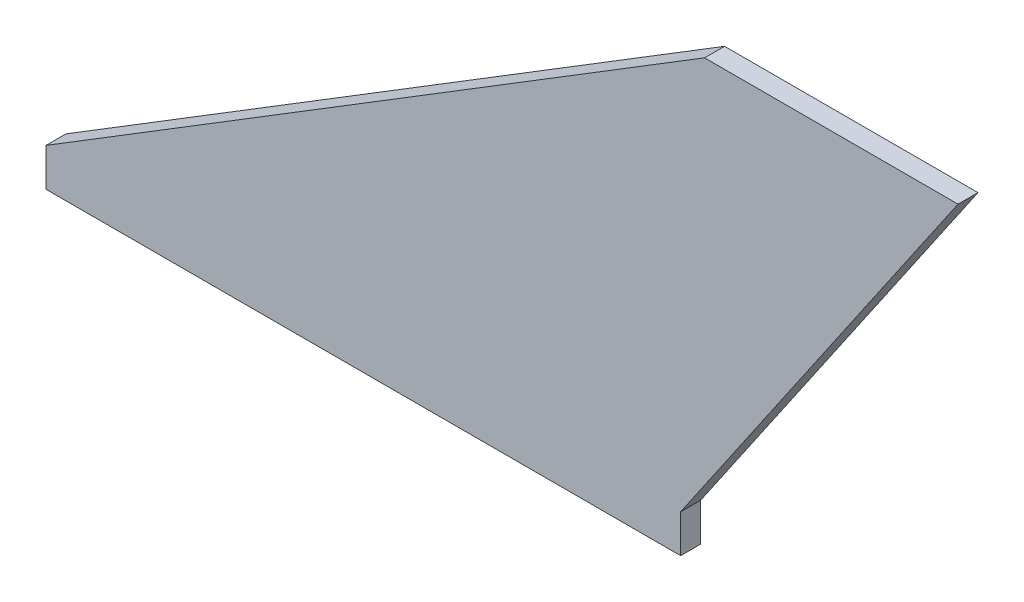
ISO-10303-21;
HEADER;
FILE_DESCRIPTION(('STEP AP214'),'2;1');
FILE_NAME('part.step','',(''),(''),'','','');
FILE_SCHEMA(('AUTOMOTIVE_DESIGN { 1 0 10303 214 1 1 1 1 }'));
ENDSEC;
DATA;
#1=APPLICATION_CONTEXT('core data for automotive mechanical design processes');
#2=APPLICATION_PROTOCOL_DEFINITION('international standard','automotive_design',2000,#1);
#3=PRODUCT_CONTEXT('',#1,'mechanical');
#4=PRODUCT('Part','Part','',(#3));
#5=PRODUCT_RELATED_PRODUCT_CATEGORY('part','',(#4));
#6=PRODUCT_DEFINITION_FORMATION('','',#4);
#7=PRODUCT_DEFINITION_CONTEXT('part definition',#1,'design');
#8=PRODUCT_DEFINITION('design','',#6,#7);
#9=PRODUCT_DEFINITION_SHAPE('','',#8);
#10=(LENGTH_UNIT() NAMED_UNIT(*) SI_UNIT(.MILLI.,.METRE.));
#11=(NAMED_UNIT(*) PLANE_ANGLE_UNIT() SI_UNIT($,.RADIAN.));
#12=(NAMED_UNIT(*) SI_UNIT($,.STERADIAN.) SOLID_ANGLE_UNIT());
#13=UNCERTAINTY_MEASURE_WITH_UNIT(LENGTH_MEASURE(1.E-05),#10,'distance_accuracy_value','');
#14=(GEOMETRIC_REPRESENTATION_CONTEXT(3) GLOBAL_UNCERTAINTY_ASSIGNED_CONTEXT((#13)) GLOBAL_UNIT_ASSIGNED_CONTEXT((#10,
#11,#12)) REPRESENTATION_CONTEXT('',''));
#15=CARTESIAN_POINT('',(0.,0.,0.));
#16=DIRECTION('',(0.,0.,1.));
#17=DIRECTION('',(1.,0.,0.));
#18=AXIS2_PLACEMENT_3D('',#15,#16,#17);
#19=CARTESIAN_POINT('',(0.,19.05,10.));
#20=DIRECTION('',(1.,0.,0.));
#21=DIRECTION('',(0.,1.,0.));
#22=AXIS2_PLACEMENT_3D('',#19,#20,#21);
#23=PLANE('',#22);
#24=DIRECTION('',(0.,-1.,0.));
#25=VECTOR('',#24,1.);
#26=CARTESIAN_POINT('',(0.,19.05,0.));
#27=LINE('',#26,#25);
#28=CARTESIAN_POINT('',(0.,19.05,0.));
#29=VERTEX_POINT('',#28);
#30=CARTESIAN_POINT('',(0.,0.,0.));
#31=VERTEX_POINT('',#30);
#32=EDGE_CURVE('E123',#29,#31,#27,.T.);
#33=ORIENTED_EDGE('',*,*,#32,.T.);
#34=DIRECTION('',(0.,0.,-1.));
#35=VECTOR('',#34,1.);
#36=CARTESIAN_POINT('',(0.,0.,10.));
#37=LINE('',#36,#35);
#38=CARTESIAN_POINT('',(0.,0.,10.));
#39=VERTEX_POINT('',#38);
#40=EDGE_CURVE('E11',#39,#31,#37,.T.);
#41=ORIENTED_EDGE('',*,*,#40,.F.);
#42=DIRECTION('',(0.,-1.,0.));
#43=VECTOR('',#42,1.);
#44=CARTESIAN_POINT('',(0.,19.05,10.));
#45=LINE('',#44,#43);
#46=CARTESIAN_POINT('',(0.,19.05,10.));
#47=VERTEX_POINT('',#46);
#48=EDGE_CURVE('E133',#47,#39,#45,.T.);
#49=ORIENTED_EDGE('',*,*,#48,.F.);
#50=DIRECTION('',(0.,0.,-1.));
#51=VECTOR('',#50,1.);
#52=CARTESIAN_POINT('',(0.,19.05,10.));
#53=LINE('',#52,#51);
#54=EDGE_CURVE('E119',#47,#29,#53,.T.);
#55=ORIENTED_EDGE('',*,*,#54,.T.);
#56=EDGE_LOOP('',(#33,#41,#49,#55));
#57=FACE_BOUND('',#56,.T.);
#58=ADVANCED_FACE('F39',(#57),#23,.F.);
#59=CARTESIAN_POINT('',(0.,0.,10.));
#60=DIRECTION('',(0.,1.,0.));
#61=DIRECTION('',(0.,0.,1.));
#62=AXIS2_PLACEMENT_3D('',#59,#60,#61);
#63=PLANE('',#62);
#64=DIRECTION('',(1.,0.,0.));
#65=VECTOR('',#64,1.);
#66=CARTESIAN_POINT('',(0.,0.,0.));
#67=LINE('',#66,#65);
#68=CARTESIAN_POINT('',(318.,0.,0.));
#69=VERTEX_POINT('',#68);
#70=EDGE_CURVE('E126',#31,#69,#67,.T.);
#71=ORIENTED_EDGE('',*,*,#70,.T.);
#72=DIRECTION('',(0.,0.,-1.));
#73=VECTOR('',#72,1.);
#74=CARTESIAN_POINT('',(318.,0.,10.));
#75=LINE('',#74,#73);
#76=CARTESIAN_POINT('',(318.,0.,10.));
#77=VERTEX_POINT('',#76);
#78=EDGE_CURVE('E47',#77,#69,#75,.T.);
#79=ORIENTED_EDGE('',*,*,#78,.F.);
#80=DIRECTION('',(1.,0.,0.));
#81=VECTOR('',#80,1.);
#82=CARTESIAN_POINT('',(0.,0.,10.));
#83=LINE('',#82,#81);
#84=EDGE_CURVE('E92',#39,#77,#83,.T.);
#85=ORIENTED_EDGE('',*,*,#84,.F.);
#86=ORIENTED_EDGE('',*,*,#40,.T.);
#87=EDGE_LOOP('',(#71,#79,#85,#86));
#88=FACE_BOUND('',#87,.T.);
#89=ADVANCED_FACE('F157',(#88),#63,.F.);
#90=CARTESIAN_POINT('',(318.,0.,10.));
#91=DIRECTION('',(-1.,0.,0.));
#92=DIRECTION('',(0.,0.,1.));
#93=AXIS2_PLACEMENT_3D('',#90,#91,#92);
#94=PLANE('',#93);
#95=DIRECTION('',(0.,1.,0.));
#96=VECTOR('',#95,1.);
#97=CARTESIAN_POINT('',(318.,0.,0.));
#98=LINE('',#97,#96);
#99=CARTESIAN_POINT('',(318.,19.05,0.));
#100=VERTEX_POINT('',#99);
#101=EDGE_CURVE('E128',#69,#100,#98,.T.);
#102=ORIENTED_EDGE('',*,*,#101,.T.);
#103=DIRECTION('',(0.,0.,-1.));
#104=VECTOR('',#103,1.);
#105=CARTESIAN_POINT('',(318.,19.05,10.));
#106=LINE('',#105,#104);
#107=CARTESIAN_POINT('',(318.,19.05,10.));
#108=VERTEX_POINT('',#107);
#109=EDGE_CURVE('E114',#108,#100,#106,.T.);
#110=ORIENTED_EDGE('',*,*,#109,.F.);
#111=DIRECTION('',(0.,1.,0.));
#112=VECTOR('',#111,1.);
#113=CARTESIAN_POINT('',(318.,0.,10.));
#114=LINE('',#113,#112);
#115=EDGE_CURVE('E105',#77,#108,#114,.T.);
#116=ORIENTED_EDGE('',*,*,#115,.F.);
#117=ORIENTED_EDGE('',*,*,#78,.T.);
#118=EDGE_LOOP('',(#102,#110,#116,#117));
#119=FACE_BOUND('',#118,.T.);
#120=ADVANCED_FACE('F139',(#119),#94,.F.);
#121=CARTESIAN_POINT('',(318.,19.05,10.));
#122=DIRECTION('',(-0.825107815772642,0.564975302425602,0.));
#123=DIRECTION('',(-0.564975302425602,-0.825107815772642,0.));
#124=AXIS2_PLACEMENT_3D('',#121,#122,#123);
#125=PLANE('',#124);
#126=DIRECTION('',(0.564975302425602,0.825107815772642,0.));
#127=VECTOR('',#126,1.);
#128=CARTESIAN_POINT('',(318.,19.05,0.));
#129=LINE('',#128,#127);
#130=CARTESIAN_POINT('',(457.,222.05,0.));
#131=VERTEX_POINT('',#130);
#132=EDGE_CURVE('E113',#100,#131,#129,.T.);
#133=ORIENTED_EDGE('',*,*,#132,.T.);
#134=DIRECTION('',(0.,0.,-1.));
#135=VECTOR('',#134,1.);
#136=CARTESIAN_POINT('',(457.,222.05,10.));
#137=LINE('',#136,#135);
#138=CARTESIAN_POINT('',(457.,222.05,10.));
#139=VERTEX_POINT('',#138);
#140=EDGE_CURVE('E110',#139,#131,#137,.T.);
#141=ORIENTED_EDGE('',*,*,#140,.F.);
#142=DIRECTION('',(0.564975302425602,0.825107815772642,0.));
#143=VECTOR('',#142,1.);
#144=CARTESIAN_POINT('',(318.,19.05,10.));
#145=LINE('',#144,#143);
#146=EDGE_CURVE('E99',#108,#139,#145,.T.);
#147=ORIENTED_EDGE('',*,*,#146,.F.);
#148=ORIENTED_EDGE('',*,*,#109,.T.);
#149=EDGE_LOOP('',(#133,#141,#147,#148));
#150=FACE_BOUND('',#149,.T.);
#151=ADVANCED_FACE('F111',(#150),#125,.F.);
#152=CARTESIAN_POINT('',(457.,222.05,10.));
#153=DIRECTION('',(0.,-1.,0.));
#154=DIRECTION('',(1.,0.,0.));
#155=AXIS2_PLACEMENT_3D('',#152,#153,#154);
#156=PLANE('',#155);
#157=DIRECTION('',(-1.,0.,0.));
#158=VECTOR('',#157,1.);
#159=CARTESIAN_POINT('',(457.,222.05,0.));
#160=LINE('',#159,#158);
#161=CARTESIAN_POINT('',(330.,222.05,0.));
#162=VERTEX_POINT('',#161);
#163=EDGE_CURVE('E78',#131,#162,#160,.T.);
#164=ORIENTED_EDGE('',*,*,#163,.T.);
#165=DIRECTION('',(0.,0.,-1.));
#166=VECTOR('',#165,1.);
#167=CARTESIAN_POINT('',(330.,222.05,10.));
#168=LINE('',#167,#166);
#169=CARTESIAN_POINT('',(330.,222.05,10.));
#170=VERTEX_POINT('',#169);
#171=EDGE_CURVE('E115',#170,#162,#168,.T.);
#172=ORIENTED_EDGE('',*,*,#171,.F.);
#173=DIRECTION('',(-1.,0.,0.));
#174=VECTOR('',#173,1.);
#175=CARTESIAN_POINT('',(457.,222.05,10.));
#176=LINE('',#175,#174);
#177=EDGE_CURVE('E103',#139,#170,#176,.T.);
#178=ORIENTED_EDGE('',*,*,#177,.F.);
#179=ORIENTED_EDGE('',*,*,#140,.T.);
#180=EDGE_LOOP('',(#164,#172,#178,#179));
#181=FACE_BOUND('',#180,.T.);
#182=ADVANCED_FACE('F117',(#181),#156,.F.);
#183=CARTESIAN_POINT('',(330.,222.05,10.));
#184=DIRECTION('',(0.523953411018677,-0.851746924316075,0.));
#185=DIRECTION('',(0.851746924316075,0.523953411018677,0.));
#186=AXIS2_PLACEMENT_3D('',#183,#184,#185);
#187=PLANE('',#186);
#188=DIRECTION('',(-0.851746924316075,-0.523953411018677,0.));
#189=VECTOR('',#188,1.);
#190=CARTESIAN_POINT('',(330.,222.05,0.));
#191=LINE('',#190,#189);
#192=EDGE_CURVE('E84',#162,#29,#191,.T.);
#193=ORIENTED_EDGE('',*,*,#192,.T.);
#194=ORIENTED_EDGE('',*,*,#54,.F.);
#195=DIRECTION('',(-0.851746924316075,-0.523953411018677,0.));
#196=VECTOR('',#195,1.);
#197=CARTESIAN_POINT('',(330.,222.05,10.));
#198=LINE('',#197,#196);
#199=EDGE_CURVE('E55',#170,#47,#198,.T.);
#200=ORIENTED_EDGE('',*,*,#199,.F.);
#201=ORIENTED_EDGE('',*,*,#171,.T.);
#202=EDGE_LOOP('',(#193,#194,#200,#201));
#203=FACE_BOUND('',#202,.T.);
#204=ADVANCED_FACE('F146',(#203),#187,.F.);
#205=CARTESIAN_POINT('',(0.,0.,10.));
#206=DIRECTION('',(0.,0.,1.));
#207=DIRECTION('',(1.,0.,0.));
#208=AXIS2_PLACEMENT_3D('',#205,#206,#207);
#209=PLANE('',#208);
#210=ORIENTED_EDGE('',*,*,#48,.T.);
#211=ORIENTED_EDGE('',*,*,#84,.T.);
#212=ORIENTED_EDGE('',*,*,#115,.T.);
#213=ORIENTED_EDGE('',*,*,#146,.T.);
#214=ORIENTED_EDGE('',*,*,#177,.T.);
#215=ORIENTED_EDGE('',*,*,#199,.T.);
#216=EDGE_LOOP('',(#210,#211,#212,#213,#214,#215));
#217=FACE_BOUND('',#216,.T.);
#218=ADVANCED_FACE('F101',(#217),#209,.T.);
#219=CARTESIAN_POINT('',(0.,0.,0.));
#220=DIRECTION('',(0.,0.,1.));
#221=DIRECTION('',(1.,0.,0.));
#222=AXIS2_PLACEMENT_3D('',#219,#220,#221);
#223=PLANE('',#222);
#224=ORIENTED_EDGE('',*,*,#32,.F.);
#225=ORIENTED_EDGE('',*,*,#192,.F.);
#226=ORIENTED_EDGE('',*,*,#163,.F.);
#227=ORIENTED_EDGE('',*,*,#132,.F.);
#228=ORIENTED_EDGE('',*,*,#101,.F.);
#229=ORIENTED_EDGE('',*,*,#70,.F.);
#230=EDGE_LOOP('',(#224,#225,#226,#227,#228,#229));
#231=FACE_BOUND('',#230,.T.);
#232=ADVANCED_FACE('F142',(#231),#223,.F.);
#233=CLOSED_SHELL('',(#58,#89,#120,#151,#182,#204,#218,#232));
#234=MANIFOLD_SOLID_BREP('B2',#233);
#235=ADVANCED_BREP_SHAPE_REPRESENTATION('',(#18,#234),#14);
#236=SHAPE_DEFINITION_REPRESENTATION(#9,#235);
ENDSEC;
END-ISO-10303-21;
